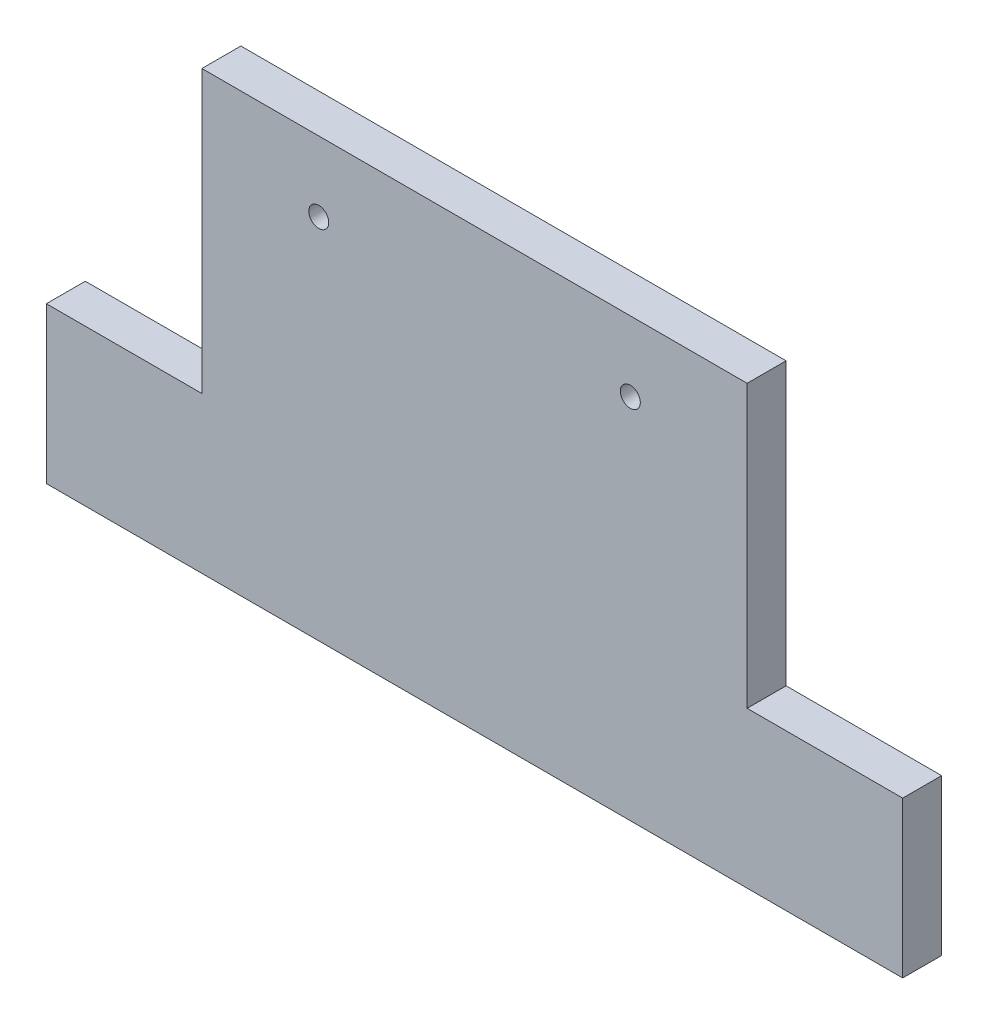
ISO-10303-21;
HEADER;
FILE_DESCRIPTION(('STEP AP214'),'2;1');
FILE_NAME('part.step','',(''),(''),'','','');
FILE_SCHEMA(('AUTOMOTIVE_DESIGN { 1 0 10303 214 1 1 1 1 }'));
ENDSEC;
DATA;
#1=APPLICATION_CONTEXT('core data for automotive mechanical design processes');
#2=APPLICATION_PROTOCOL_DEFINITION('international standard','automotive_design',2000,#1);
#3=PRODUCT_CONTEXT('',#1,'mechanical');
#4=PRODUCT('Part','Part','',(#3));
#5=PRODUCT_RELATED_PRODUCT_CATEGORY('part','',(#4));
#6=PRODUCT_DEFINITION_FORMATION('','',#4);
#7=PRODUCT_DEFINITION_CONTEXT('part definition',#1,'design');
#8=PRODUCT_DEFINITION('design','',#6,#7);
#9=PRODUCT_DEFINITION_SHAPE('','',#8);
#10=(LENGTH_UNIT() NAMED_UNIT(*) SI_UNIT(.MILLI.,.METRE.));
#11=(NAMED_UNIT(*) PLANE_ANGLE_UNIT() SI_UNIT($,.RADIAN.));
#12=(NAMED_UNIT(*) SI_UNIT($,.STERADIAN.) SOLID_ANGLE_UNIT());
#13=UNCERTAINTY_MEASURE_WITH_UNIT(LENGTH_MEASURE(1.E-05),#10,'distance_accuracy_value','');
#14=(GEOMETRIC_REPRESENTATION_CONTEXT(3) GLOBAL_UNCERTAINTY_ASSIGNED_CONTEXT((#13)) GLOBAL_UNIT_ASSIGNED_CONTEXT((#10,
#11,#12)) REPRESENTATION_CONTEXT('',''));
#15=CARTESIAN_POINT('',(0.,0.,0.));
#16=DIRECTION('',(0.,0.,1.));
#17=DIRECTION('',(1.,0.,0.));
#18=AXIS2_PLACEMENT_3D('',#15,#16,#17);
#19=CARTESIAN_POINT('',(-44.45,48.3471010076328,0.));
#20=DIRECTION('',(-1.,0.,0.));
#21=DIRECTION('',(0.,-1.,0.));
#22=AXIS2_PLACEMENT_3D('',#19,#20,#21);
#23=PLANE('',#22);
#24=DIRECTION('',(0.,-1.,0.));
#25=VECTOR('',#24,1.);
#26=CARTESIAN_POINT('',(-44.45,48.3471010076328,0.));
#27=LINE('',#26,#25);
#28=CARTESIAN_POINT('',(-44.45,71.2942020152657,0.));
#29=VERTEX_POINT('',#28);
#30=CARTESIAN_POINT('',(-44.4499999999999,25.4,0.));
#31=VERTEX_POINT('',#30);
#32=EDGE_CURVE('E49',#29,#31,#27,.T.);
#33=ORIENTED_EDGE('',*,*,#32,.T.);
#34=DIRECTION('',(0.,0.,-1.));
#35=VECTOR('',#34,1.);
#36=CARTESIAN_POINT('',(-44.4499999999999,25.4,0.));
#37=LINE('',#36,#35);
#38=CARTESIAN_POINT('',(-44.45,25.4,6.35));
#39=VERTEX_POINT('',#38);
#40=EDGE_CURVE('E189',#39,#31,#37,.T.);
#41=ORIENTED_EDGE('',*,*,#40,.F.);
#42=DIRECTION('',(0.,-1.,0.));
#43=VECTOR('',#42,1.);
#44=CARTESIAN_POINT('',(-44.45,48.3471010076328,6.35));
#45=LINE('',#44,#43);
#46=CARTESIAN_POINT('',(-44.45,71.2942020152657,6.35000000000001));
#47=VERTEX_POINT('',#46);
#48=EDGE_CURVE('E81',#47,#39,#45,.T.);
#49=ORIENTED_EDGE('',*,*,#48,.F.);
#50=DIRECTION('',(0.,0.,-1.));
#51=VECTOR('',#50,1.);
#52=CARTESIAN_POINT('',(-44.45,71.2942020152657,0.));
#53=LINE('',#52,#51);
#54=EDGE_CURVE('E163',#47,#29,#53,.T.);
#55=ORIENTED_EDGE('',*,*,#54,.T.);
#56=EDGE_LOOP('',(#33,#41,#49,#55));
#57=FACE_BOUND('',#56,.T.);
#58=ADVANCED_FACE('F45',(#57),#23,.T.);
#59=CARTESIAN_POINT('',(44.45,48.3471010076328,0.));
#60=DIRECTION('',(-1.,0.,0.));
#61=DIRECTION('',(0.,-1.,0.));
#62=AXIS2_PLACEMENT_3D('',#59,#60,#61);
#63=PLANE('',#62);
#64=DIRECTION('',(0.,-1.,0.));
#65=VECTOR('',#64,1.);
#66=CARTESIAN_POINT('',(44.45,48.3471010076328,0.));
#67=LINE('',#66,#65);
#68=CARTESIAN_POINT('',(44.45,71.2942020152656,0.));
#69=VERTEX_POINT('',#68);
#70=CARTESIAN_POINT('',(44.45,25.4,0.));
#71=VERTEX_POINT('',#70);
#72=EDGE_CURVE('E12',#69,#71,#67,.T.);
#73=ORIENTED_EDGE('',*,*,#72,.F.);
#74=DIRECTION('',(0.,0.,-1.));
#75=VECTOR('',#74,1.);
#76=CARTESIAN_POINT('',(44.45,71.2942020152656,0.));
#77=LINE('',#76,#75);
#78=CARTESIAN_POINT('',(44.45,71.2942020152656,6.35000000000001));
#79=VERTEX_POINT('',#78);
#80=EDGE_CURVE('E180',#79,#69,#77,.T.);
#81=ORIENTED_EDGE('',*,*,#80,.F.);
#82=DIRECTION('',(0.,-1.,0.));
#83=VECTOR('',#82,1.);
#84=CARTESIAN_POINT('',(44.45,48.3471010076328,6.35));
#85=LINE('',#84,#83);
#86=CARTESIAN_POINT('',(44.45,25.4,6.35));
#87=VERTEX_POINT('',#86);
#88=EDGE_CURVE('E63',#79,#87,#85,.T.);
#89=ORIENTED_EDGE('',*,*,#88,.T.);
#90=DIRECTION('',(0.,0.,-1.));
#91=VECTOR('',#90,1.);
#92=CARTESIAN_POINT('',(44.45,25.4,0.));
#93=LINE('',#92,#91);
#94=EDGE_CURVE('E140',#87,#71,#93,.T.);
#95=ORIENTED_EDGE('',*,*,#94,.T.);
#96=EDGE_LOOP('',(#73,#81,#89,#95));
#97=FACE_BOUND('',#96,.T.);
#98=ADVANCED_FACE('F188',(#97),#63,.F.);
#99=CARTESIAN_POINT('',(55.7422388922173,25.4,0.));
#100=DIRECTION('',(0.,0.,1.));
#101=DIRECTION('',(1.,0.,0.));
#102=AXIS2_PLACEMENT_3D('',#99,#100,#101);
#103=PLANE('',#102);
#104=ORIENTED_EDGE('',*,*,#32,.F.);
#105=DIRECTION('',(-1.,0.,0.));
#106=VECTOR('',#105,1.);
#107=CARTESIAN_POINT('',(-44.45,71.2942020152657,0.));
#108=LINE('',#107,#106);
#109=EDGE_CURVE('E177',#69,#29,#108,.T.);
#110=ORIENTED_EDGE('',*,*,#109,.F.);
#111=ORIENTED_EDGE('',*,*,#72,.T.);
#112=DIRECTION('',(-1.,0.,0.));
#113=VECTOR('',#112,1.);
#114=CARTESIAN_POINT('',(69.8096691747781,25.4,0.));
#115=LINE('',#114,#113);
#116=CARTESIAN_POINT('',(69.8096691747781,25.4,0.));
#117=VERTEX_POINT('',#116);
#118=EDGE_CURVE('E129',#117,#71,#115,.T.);
#119=ORIENTED_EDGE('',*,*,#118,.F.);
#120=DIRECTION('',(0.,-1.,0.));
#121=VECTOR('',#120,1.);
#122=CARTESIAN_POINT('',(69.8096691747781,25.4,0.));
#123=LINE('',#122,#121);
#124=CARTESIAN_POINT('',(69.8096691747781,0.,0.));
#125=VERTEX_POINT('',#124);
#126=EDGE_CURVE('E125',#117,#125,#123,.T.);
#127=ORIENTED_EDGE('',*,*,#126,.T.);
#128=DIRECTION('',(-1.,0.,0.));
#129=VECTOR('',#128,1.);
#130=CARTESIAN_POINT('',(69.8096691747781,0.,0.));
#131=LINE('',#130,#129);
#132=CARTESIAN_POINT('',(-69.809669174778,0.,0.));
#133=VERTEX_POINT('',#132);
#134=EDGE_CURVE('E141',#125,#133,#131,.T.);
#135=ORIENTED_EDGE('',*,*,#134,.T.);
#136=DIRECTION('',(0.,-1.,0.));
#137=VECTOR('',#136,1.);
#138=CARTESIAN_POINT('',(-69.809669174778,25.4,0.));
#139=LINE('',#138,#137);
#140=CARTESIAN_POINT('',(-69.809669174778,25.4,0.));
#141=VERTEX_POINT('',#140);
#142=EDGE_CURVE('E155',#141,#133,#139,.T.);
#143=ORIENTED_EDGE('',*,*,#142,.F.);
#144=DIRECTION('',(-1.,0.,0.));
#145=VECTOR('',#144,1.);
#146=CARTESIAN_POINT('',(-57.109669174778,25.4,0.));
#147=LINE('',#146,#145);
#148=EDGE_CURVE('E154',#31,#141,#147,.T.);
#149=ORIENTED_EDGE('',*,*,#148,.F.);
#150=EDGE_LOOP('',(#104,#110,#111,#119,#127,#135,#143,#149));
#151=FACE_BOUND('',#150,.T.);
#152=CARTESIAN_POINT('',(-25.4,59.8642020152656,0.));
#153=DIRECTION('',(0.,0.,1.));
#154=DIRECTION('',(-1.,0.,0.));
#155=AXIS2_PLACEMENT_3D('',#152,#153,#154);
#156=CIRCLE('',#155,1.63195);
#157=CARTESIAN_POINT('',(-27.03195,59.8642020152656,0.));
#158=VERTEX_POINT('',#157);
#159=EDGE_CURVE('E165',#158,#158,#156,.F.);
#160=ORIENTED_EDGE('',*,*,#159,.F.);
#161=EDGE_LOOP('',(#160));
#162=FACE_BOUND('',#161,.T.);
#163=CARTESIAN_POINT('',(25.4,59.8642020152656,0.));
#164=DIRECTION('',(0.,0.,1.));
#165=DIRECTION('',(-1.,0.,0.));
#166=AXIS2_PLACEMENT_3D('',#163,#164,#165);
#167=CIRCLE('',#166,1.63195);
#168=CARTESIAN_POINT('',(23.76805,59.8642020152656,0.));
#169=VERTEX_POINT('',#168);
#170=EDGE_CURVE('E171',#169,#169,#167,.F.);
#171=ORIENTED_EDGE('',*,*,#170,.F.);
#172=EDGE_LOOP('',(#171));
#173=FACE_BOUND('',#172,.T.);
#174=ADVANCED_FACE('F47',(#151,#162,#173),#103,.F.);
#175=CARTESIAN_POINT('',(-44.45,48.3471010076328,6.35));
#176=DIRECTION('',(0.,0.,1.));
#177=DIRECTION('',(-1.,0.,0.));
#178=AXIS2_PLACEMENT_3D('',#175,#176,#177);
#179=PLANE('',#178);
#180=ORIENTED_EDGE('',*,*,#48,.T.);
#181=DIRECTION('',(1.,0.,0.));
#182=VECTOR('',#181,1.);
#183=CARTESIAN_POINT('',(-57.109669174778,25.4,6.35));
#184=LINE('',#183,#182);
#185=CARTESIAN_POINT('',(-69.809669174778,25.4,6.35));
#186=VERTEX_POINT('',#185);
#187=EDGE_CURVE('E145',#39,#186,#184,.F.);
#188=ORIENTED_EDGE('',*,*,#187,.T.);
#189=DIRECTION('',(0.,1.,0.));
#190=VECTOR('',#189,1.);
#191=CARTESIAN_POINT('',(-69.809669174778,25.4,6.35));
#192=LINE('',#191,#190);
#193=CARTESIAN_POINT('',(-69.809669174778,0.,6.35));
#194=VERTEX_POINT('',#193);
#195=EDGE_CURVE('E142',#186,#194,#192,.F.);
#196=ORIENTED_EDGE('',*,*,#195,.T.);
#197=DIRECTION('',(1.,0.,0.));
#198=VECTOR('',#197,1.);
#199=CARTESIAN_POINT('',(-57.109669174778,0.,6.35));
#200=LINE('',#199,#198);
#201=CARTESIAN_POINT('',(69.8096691747781,0.,6.34999999999999));
#202=VERTEX_POINT('',#201);
#203=EDGE_CURVE('E137',#202,#194,#200,.F.);
#204=ORIENTED_EDGE('',*,*,#203,.F.);
#205=DIRECTION('',(0.,1.,0.));
#206=VECTOR('',#205,1.);
#207=CARTESIAN_POINT('',(69.8096691747781,25.4,6.34999999999999));
#208=LINE('',#207,#206);
#209=CARTESIAN_POINT('',(69.8096691747781,25.4,6.34999999999999));
#210=VERTEX_POINT('',#209);
#211=EDGE_CURVE('E124',#210,#202,#208,.F.);
#212=ORIENTED_EDGE('',*,*,#211,.F.);
#213=DIRECTION('',(1.,0.,0.));
#214=VECTOR('',#213,1.);
#215=CARTESIAN_POINT('',(69.8096691747781,25.4,6.34999999999999));
#216=LINE('',#215,#214);
#217=EDGE_CURVE('E133',#210,#87,#216,.F.);
#218=ORIENTED_EDGE('',*,*,#217,.T.);
#219=ORIENTED_EDGE('',*,*,#88,.F.);
#220=DIRECTION('',(-1.,0.,0.));
#221=VECTOR('',#220,1.);
#222=CARTESIAN_POINT('',(-44.45,71.2942020152657,6.35000000000001));
#223=LINE('',#222,#221);
#224=EDGE_CURVE('E161',#79,#47,#223,.T.);
#225=ORIENTED_EDGE('',*,*,#224,.T.);
#226=EDGE_LOOP('',(#180,#188,#196,#204,#212,#218,#219,#225));
#227=FACE_BOUND('',#226,.T.);
#228=CARTESIAN_POINT('',(-25.4,59.8642020152656,6.34999999999999));
#229=DIRECTION('',(0.,0.,1.));
#230=DIRECTION('',(1.,0.,0.));
#231=AXIS2_PLACEMENT_3D('',#228,#229,#230);
#232=CIRCLE('',#231,1.63195);
#233=CARTESIAN_POINT('',(-23.76805,59.8642020152656,6.34999999999999));
#234=VERTEX_POINT('',#233);
#235=EDGE_CURVE('E168',#234,#234,#232,.T.);
#236=ORIENTED_EDGE('',*,*,#235,.F.);
#237=EDGE_LOOP('',(#236));
#238=FACE_BOUND('',#237,.T.);
#239=CARTESIAN_POINT('',(25.4,59.8642020152656,6.35000000000001));
#240=DIRECTION('',(0.,0.,1.));
#241=DIRECTION('',(-1.,0.,0.));
#242=AXIS2_PLACEMENT_3D('',#239,#240,#241);
#243=CIRCLE('',#242,1.63195);
#244=CARTESIAN_POINT('',(23.76805,59.8642020152656,6.35000000000001));
#245=VERTEX_POINT('',#244);
#246=EDGE_CURVE('E174',#245,#245,#243,.T.);
#247=ORIENTED_EDGE('',*,*,#246,.F.);
#248=EDGE_LOOP('',(#247));
#249=FACE_BOUND('',#248,.T.);
#250=ADVANCED_FACE('F131',(#227,#238,#249),#179,.T.);
#251=CARTESIAN_POINT('',(-44.45,71.2942020152657,0.));
#252=DIRECTION('',(0.,1.,0.));
#253=DIRECTION('',(-1.,0.,0.));
#254=AXIS2_PLACEMENT_3D('',#251,#252,#253);
#255=PLANE('',#254);
#256=ORIENTED_EDGE('',*,*,#54,.F.);
#257=ORIENTED_EDGE('',*,*,#224,.F.);
#258=ORIENTED_EDGE('',*,*,#80,.T.);
#259=ORIENTED_EDGE('',*,*,#109,.T.);
#260=EDGE_LOOP('',(#256,#257,#258,#259));
#261=FACE_BOUND('',#260,.T.);
#262=ADVANCED_FACE('F205',(#261),#255,.T.);
#263=CARTESIAN_POINT('',(25.4,59.8642020152656,-12.701025));
#264=DIRECTION('',(0.,0.,1.));
#265=DIRECTION('',(-1.,0.,0.));
#266=AXIS2_PLACEMENT_3D('',#263,#264,#265);
#267=CYLINDRICAL_SURFACE('',#266,1.63195);
#268=ORIENTED_EDGE('',*,*,#246,.T.);
#269=EDGE_LOOP('',(#268));
#270=FACE_BOUND('',#269,.T.);
#271=ORIENTED_EDGE('',*,*,#170,.T.);
#272=EDGE_LOOP('',(#271));
#273=FACE_BOUND('',#272,.T.);
#274=ADVANCED_FACE('F207',(#270,#273),#267,.F.);
#275=CARTESIAN_POINT('',(-25.4,59.8642020152656,-12.701025));
#276=DIRECTION('',(0.,0.,1.));
#277=DIRECTION('',(-1.,0.,0.));
#278=AXIS2_PLACEMENT_3D('',#275,#276,#277);
#279=CYLINDRICAL_SURFACE('',#278,1.63195);
#280=ORIENTED_EDGE('',*,*,#235,.T.);
#281=EDGE_LOOP('',(#280));
#282=FACE_BOUND('',#281,.T.);
#283=ORIENTED_EDGE('',*,*,#159,.T.);
#284=EDGE_LOOP('',(#283));
#285=FACE_BOUND('',#284,.T.);
#286=ADVANCED_FACE('F213',(#282,#285),#279,.F.);
#287=CARTESIAN_POINT('',(69.8096691747781,25.4,0.));
#288=DIRECTION('',(-1.,0.,0.));
#289=DIRECTION('',(0.,-1.,0.));
#290=AXIS2_PLACEMENT_3D('',#287,#288,#289);
#291=PLANE('',#290);
#292=DIRECTION('',(0.,0.,-1.));
#293=VECTOR('',#292,1.);
#294=CARTESIAN_POINT('',(69.8096691747781,25.4,0.));
#295=LINE('',#294,#293);
#296=EDGE_CURVE('E121',#210,#117,#295,.T.);
#297=ORIENTED_EDGE('',*,*,#296,.F.);
#298=ORIENTED_EDGE('',*,*,#211,.T.);
#299=DIRECTION('',(0.,0.,-1.));
#300=VECTOR('',#299,1.);
#301=CARTESIAN_POINT('',(69.8096691747781,0.,0.));
#302=LINE('',#301,#300);
#303=EDGE_CURVE('E118',#202,#125,#302,.T.);
#304=ORIENTED_EDGE('',*,*,#303,.T.);
#305=ORIENTED_EDGE('',*,*,#126,.F.);
#306=EDGE_LOOP('',(#297,#298,#304,#305));
#307=FACE_BOUND('',#306,.T.);
#308=ADVANCED_FACE('F123',(#307),#291,.F.);
#309=CARTESIAN_POINT('',(69.8096691747781,25.4,0.));
#310=DIRECTION('',(0.,1.,0.));
#311=DIRECTION('',(-1.,0.,0.));
#312=AXIS2_PLACEMENT_3D('',#309,#310,#311);
#313=PLANE('',#312);
#314=ORIENTED_EDGE('',*,*,#217,.F.);
#315=ORIENTED_EDGE('',*,*,#296,.T.);
#316=ORIENTED_EDGE('',*,*,#118,.T.);
#317=ORIENTED_EDGE('',*,*,#94,.F.);
#318=EDGE_LOOP('',(#314,#315,#316,#317));
#319=FACE_BOUND('',#318,.T.);
#320=ADVANCED_FACE('F139',(#319),#313,.T.);
#321=CARTESIAN_POINT('',(-69.809669174778,25.4,0.));
#322=DIRECTION('',(-1.,0.,0.));
#323=DIRECTION('',(0.,-1.,0.));
#324=AXIS2_PLACEMENT_3D('',#321,#322,#323);
#325=PLANE('',#324);
#326=DIRECTION('',(0.,0.,-1.));
#327=VECTOR('',#326,1.);
#328=CARTESIAN_POINT('',(-69.809669174778,0.,0.));
#329=LINE('',#328,#327);
#330=EDGE_CURVE('E150',#194,#133,#329,.T.);
#331=ORIENTED_EDGE('',*,*,#330,.F.);
#332=ORIENTED_EDGE('',*,*,#195,.F.);
#333=DIRECTION('',(0.,0.,-1.));
#334=VECTOR('',#333,1.);
#335=CARTESIAN_POINT('',(-69.809669174778,25.4,0.));
#336=LINE('',#335,#334);
#337=EDGE_CURVE('E158',#186,#141,#336,.T.);
#338=ORIENTED_EDGE('',*,*,#337,.T.);
#339=ORIENTED_EDGE('',*,*,#142,.T.);
#340=EDGE_LOOP('',(#331,#332,#338,#339));
#341=FACE_BOUND('',#340,.T.);
#342=ADVANCED_FACE('F199',(#341),#325,.T.);
#343=CARTESIAN_POINT('',(-57.109669174778,25.4,0.));
#344=DIRECTION('',(0.,1.,0.));
#345=DIRECTION('',(-1.,0.,0.));
#346=AXIS2_PLACEMENT_3D('',#343,#344,#345);
#347=PLANE('',#346);
#348=ORIENTED_EDGE('',*,*,#337,.F.);
#349=ORIENTED_EDGE('',*,*,#187,.F.);
#350=ORIENTED_EDGE('',*,*,#40,.T.);
#351=ORIENTED_EDGE('',*,*,#148,.T.);
#352=EDGE_LOOP('',(#348,#349,#350,#351));
#353=FACE_BOUND('',#352,.T.);
#354=ADVANCED_FACE('F202',(#353),#347,.T.);
#355=CARTESIAN_POINT('',(-57.109669174778,0.,0.));
#356=DIRECTION('',(0.,1.,0.));
#357=DIRECTION('',(-1.,0.,0.));
#358=AXIS2_PLACEMENT_3D('',#355,#356,#357);
#359=PLANE('',#358);
#360=ORIENTED_EDGE('',*,*,#330,.T.);
#361=ORIENTED_EDGE('',*,*,#134,.F.);
#362=ORIENTED_EDGE('',*,*,#303,.F.);
#363=ORIENTED_EDGE('',*,*,#203,.T.);
#364=EDGE_LOOP('',(#360,#361,#362,#363));
#365=FACE_BOUND('',#364,.T.);
#366=ADVANCED_FACE('F196',(#365),#359,.F.);
#367=CLOSED_SHELL('',(#58,#98,#174,#250,#262,#274,#286,#308,#320,#342,#354,#366));
#368=MANIFOLD_SOLID_BREP('B2',#367);
#369=ADVANCED_BREP_SHAPE_REPRESENTATION('',(#18,#368),#14);
#370=SHAPE_DEFINITION_REPRESENTATION(#9,#369);
ENDSEC;
END-ISO-10303-21;
